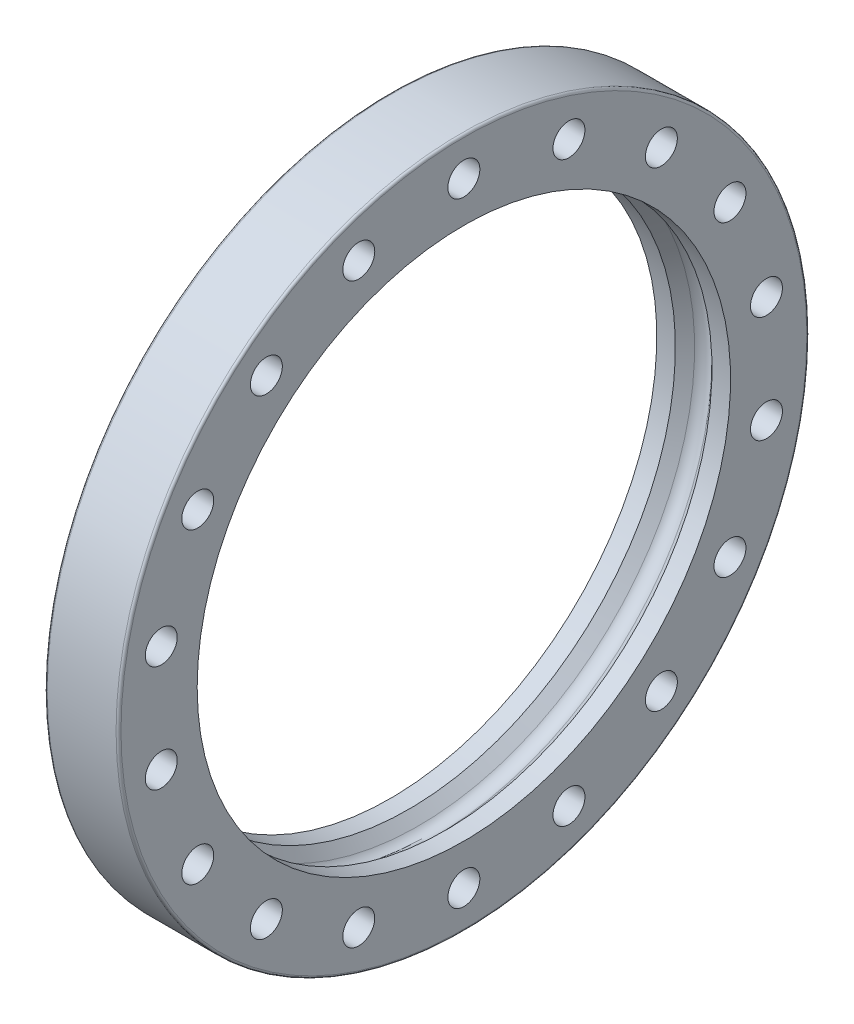
ISO-10303-21;
HEADER;
FILE_DESCRIPTION(('STEP AP214'),'2;1');
FILE_NAME('part.step','',(''),(''),'','','');
FILE_SCHEMA(('AUTOMOTIVE_DESIGN { 1 0 10303 214 1 1 1 1 }'));
ENDSEC;
DATA;
#1=APPLICATION_CONTEXT('core data for automotive mechanical design processes');
#2=APPLICATION_PROTOCOL_DEFINITION('international standard','automotive_design',2000,#1);
#3=PRODUCT_CONTEXT('',#1,'mechanical');
#4=PRODUCT('Part','Part','',(#3));
#5=PRODUCT_RELATED_PRODUCT_CATEGORY('part','',(#4));
#6=PRODUCT_DEFINITION_FORMATION('','',#4);
#7=PRODUCT_DEFINITION_CONTEXT('part definition',#1,'design');
#8=PRODUCT_DEFINITION('design','',#6,#7);
#9=PRODUCT_DEFINITION_SHAPE('','',#8);
#10=(LENGTH_UNIT() NAMED_UNIT(*) SI_UNIT(.MILLI.,.METRE.));
#11=(NAMED_UNIT(*) PLANE_ANGLE_UNIT() SI_UNIT($,.RADIAN.));
#12=(NAMED_UNIT(*) SI_UNIT($,.STERADIAN.) SOLID_ANGLE_UNIT());
#13=UNCERTAINTY_MEASURE_WITH_UNIT(LENGTH_MEASURE(1.E-05),#10,'distance_accuracy_value','');
#14=(GEOMETRIC_REPRESENTATION_CONTEXT(3) GLOBAL_UNCERTAINTY_ASSIGNED_CONTEXT((#13)) GLOBAL_UNIT_ASSIGNED_CONTEXT((#10,
#11,#12)) REPRESENTATION_CONTEXT('',''));
#15=CARTESIAN_POINT('',(0.,0.,0.));
#16=DIRECTION('',(0.,0.,1.));
#17=DIRECTION('',(1.,0.,0.));
#18=AXIS2_PLACEMENT_3D('',#15,#16,#17);
#19=CARTESIAN_POINT('',(0.,0.,0.));
#20=DIRECTION('',(1.,0.,0.));
#21=DIRECTION('',(0.,0.,-1.));
#22=AXIS2_PLACEMENT_3D('',#19,#20,#21);
#23=CONICAL_SURFACE('',#22,115.942388155425,0.785398163397447);
#24=CARTESIAN_POINT('',(-3.53553390593273,0.,0.));
#25=DIRECTION('',(-1.,0.,0.));
#26=DIRECTION('',(0.,0.,1.));
#27=AXIS2_PLACEMENT_3D('',#24,#25,#26);
#28=CIRCLE('',#27,112.406854249492);
#29=CARTESIAN_POINT('',(-3.53553390593273,0.,112.406854249492));
#30=VERTEX_POINT('',#29);
#31=EDGE_CURVE('E10',#30,#30,#28,.F.);
#32=ORIENTED_EDGE('',*,*,#31,.T.);
#33=EDGE_LOOP('',(#32));
#34=FACE_BOUND('',#33,.T.);
#35=CARTESIAN_POINT('',(-7.4423881554251,0.,0.));
#36=DIRECTION('',(-1.,0.,0.));
#37=DIRECTION('',(0.,0.,1.));
#38=AXIS2_PLACEMENT_3D('',#35,#36,#37);
#39=CIRCLE('',#38,108.5);
#40=CARTESIAN_POINT('',(-7.4423881554251,0.,108.5));
#41=VERTEX_POINT('',#40);
#42=EDGE_CURVE('E68',#41,#41,#39,.T.);
#43=ORIENTED_EDGE('',*,*,#42,.T.);
#44=EDGE_LOOP('',(#43));
#45=FACE_BOUND('',#44,.T.);
#46=ADVANCED_FACE('F33',(#34,#45),#23,.F.);
#47=CARTESIAN_POINT('',(0.,0.,0.));
#48=DIRECTION('',(-1.,0.,0.));
#49=DIRECTION('',(0.,0.,1.));
#50=AXIS2_PLACEMENT_3D('',#47,#48,#49);
#51=CONICAL_SURFACE('',#50,115.942388155425,0.785398163397448);
#52=CARTESIAN_POINT('',(3.53553390593277,0.,0.));
#53=DIRECTION('',(1.,0.,0.));
#54=DIRECTION('',(0.,0.,-1.));
#55=AXIS2_PLACEMENT_3D('',#52,#53,#54);
#56=CIRCLE('',#55,112.406854249492);
#57=CARTESIAN_POINT('',(3.53553390593277,0.,-112.406854249492));
#58=VERTEX_POINT('',#57);
#59=EDGE_CURVE('E40',#58,#58,#56,.F.);
#60=ORIENTED_EDGE('',*,*,#59,.T.);
#61=EDGE_LOOP('',(#60));
#62=FACE_BOUND('',#61,.T.);
#63=CARTESIAN_POINT('',(7.44238815542518,0.,0.));
#64=DIRECTION('',(-1.,0.,0.));
#65=DIRECTION('',(0.,0.,1.));
#66=AXIS2_PLACEMENT_3D('',#63,#64,#65);
#67=CIRCLE('',#66,108.5);
#68=CARTESIAN_POINT('',(7.44238815542518,0.,108.5));
#69=VERTEX_POINT('',#68);
#70=EDGE_CURVE('E59',#69,#69,#67,.T.);
#71=ORIENTED_EDGE('',*,*,#70,.F.);
#72=EDGE_LOOP('',(#71));
#73=FACE_BOUND('',#72,.T.);
#74=ADVANCED_FACE('F207',(#62,#73),#51,.F.);
#75=CARTESIAN_POINT('',(0.,0.,0.));
#76=DIRECTION('',(-1.,0.,0.));
#77=DIRECTION('',(0.,0.,1.));
#78=AXIS2_PLACEMENT_3D('',#75,#76,#77);
#79=CYLINDRICAL_SURFACE('',#78,108.5);
#80=ORIENTED_EDGE('',*,*,#70,.T.);
#81=EDGE_LOOP('',(#80));
#82=FACE_BOUND('',#81,.T.);
#83=CARTESIAN_POINT('',(15.,0.,0.));
#84=DIRECTION('',(-1.,0.,0.));
#85=DIRECTION('',(0.,0.,1.));
#86=AXIS2_PLACEMENT_3D('',#83,#84,#85);
#87=CIRCLE('',#86,108.5);
#88=CARTESIAN_POINT('',(15.,0.,108.5));
#89=VERTEX_POINT('',#88);
#90=EDGE_CURVE('E62',#89,#89,#87,.T.);
#91=ORIENTED_EDGE('',*,*,#90,.F.);
#92=EDGE_LOOP('',(#91));
#93=FACE_BOUND('',#92,.T.);
#94=ADVANCED_FACE('F195',(#82,#93),#79,.F.);
#95=CARTESIAN_POINT('',(15.,0.,0.));
#96=DIRECTION('',(1.,0.,0.));
#97=DIRECTION('',(0.,0.,-1.));
#98=AXIS2_PLACEMENT_3D('',#95,#96,#97);
#99=PLANE('',#98);
#100=CARTESIAN_POINT('',(15.,117.461577598239,42.7525179157071));
#101=DIRECTION('',(1.,0.,0.));
#102=DIRECTION('',(0.,0.342020143325657,-0.939692620785913));
#103=AXIS2_PLACEMENT_3D('',#100,#101,#102);
#104=CIRCLE('',#103,6.5);
#105=CARTESIAN_POINT('',(15.,119.684708529856,36.6445158805987));
#106=VERTEX_POINT('',#105);
#107=EDGE_CURVE('E84',#106,#106,#104,.T.);
#108=ORIENTED_EDGE('',*,*,#107,.F.);
#109=EDGE_LOOP('',(#108));
#110=FACE_BOUND('',#109,.T.);
#111=CARTESIAN_POINT('',(15.,95.7555553898733,80.3484512108163));
#112=DIRECTION('',(1.,0.,0.));
#113=DIRECTION('',(0.,0.64278760968653,-0.766044443118986));
#114=AXIS2_PLACEMENT_3D('',#111,#112,#113);
#115=CIRCLE('',#114,6.5);
#116=CARTESIAN_POINT('',(15.,99.9336748528357,75.3691623305429));
#117=VERTEX_POINT('',#116);
#118=EDGE_CURVE('E90',#117,#117,#115,.T.);
#119=ORIENTED_EDGE('',*,*,#118,.F.);
#120=EDGE_LOOP('',(#119));
#121=FACE_BOUND('',#120,.T.);
#122=CARTESIAN_POINT('',(15.,62.5000000000013,108.253175473054));
#123=DIRECTION('',(1.,0.,0.));
#124=DIRECTION('',(0.,0.866025403784433,-0.50000000000001));
#125=AXIS2_PLACEMENT_3D('',#122,#123,#124);
#126=CIRCLE('',#125,6.5);
#127=CARTESIAN_POINT('',(15.,68.1291651246001,105.003175473054));
#128=VERTEX_POINT('',#127);
#129=EDGE_CURVE('E96',#128,#128,#126,.T.);
#130=ORIENTED_EDGE('',*,*,#129,.F.);
#131=EDGE_LOOP('',(#130));
#132=FACE_BOUND('',#131,.T.);
#133=CARTESIAN_POINT('',(15.,21.7060222083676,123.100969126526));
#134=DIRECTION('',(1.,0.,0.));
#135=DIRECTION('',(0.,0.984807753012206,-0.17364817766694));
#136=AXIS2_PLACEMENT_3D('',#133,#134,#135);
#137=CIRCLE('',#136,6.5);
#138=CARTESIAN_POINT('',(15.,28.1072726029469,121.972255971691));
#139=VERTEX_POINT('',#138);
#140=EDGE_CURVE('E102',#139,#139,#137,.T.);
#141=ORIENTED_EDGE('',*,*,#140,.F.);
#142=EDGE_LOOP('',(#141));
#143=FACE_BOUND('',#142,.T.);
#144=CARTESIAN_POINT('',(15.,-21.7060222083651,123.100969126526));
#145=DIRECTION('',(1.,0.,0.));
#146=DIRECTION('',(0.,0.98480775301221,0.173648177666921));
#147=AXIS2_PLACEMENT_3D('',#144,#145,#146);
#148=CIRCLE('',#147,6.5);
#149=CARTESIAN_POINT('',(15.,-15.3047718137857,124.229682281361));
#150=VERTEX_POINT('',#149);
#151=EDGE_CURVE('E108',#150,#150,#148,.T.);
#152=ORIENTED_EDGE('',*,*,#151,.F.);
#153=EDGE_LOOP('',(#152));
#154=FACE_BOUND('',#153,.T.);
#155=CARTESIAN_POINT('',(15.,-62.499999999999,108.253175473055));
#156=DIRECTION('',(1.,0.,0.));
#157=DIRECTION('',(0.,0.866025403784443,0.499999999999992));
#158=AXIS2_PLACEMENT_3D('',#155,#156,#157);
#159=CIRCLE('',#158,6.5);
#160=CARTESIAN_POINT('',(15.,-56.8708348754001,111.503175473055));
#161=VERTEX_POINT('',#160);
#162=EDGE_CURVE('E114',#161,#161,#159,.T.);
#163=ORIENTED_EDGE('',*,*,#162,.F.);
#164=EDGE_LOOP('',(#163));
#165=FACE_BOUND('',#164,.T.);
#166=CARTESIAN_POINT('',(15.,-95.7555553898716,80.3484512108182));
#167=DIRECTION('',(1.,0.,0.));
#168=DIRECTION('',(0.,0.642787609686546,0.766044443118973));
#169=AXIS2_PLACEMENT_3D('',#166,#167,#168);
#170=CIRCLE('',#169,6.5);
#171=CARTESIAN_POINT('',(15.,-91.577435926909,85.3277400910915));
#172=VERTEX_POINT('',#171);
#173=EDGE_CURVE('E120',#172,#172,#170,.T.);
#174=ORIENTED_EDGE('',*,*,#173,.F.);
#175=EDGE_LOOP('',(#174));
#176=FACE_BOUND('',#175,.T.);
#177=CARTESIAN_POINT('',(15.,-117.461577598238,42.7525179157095));
#178=DIRECTION('',(1.,0.,0.));
#179=DIRECTION('',(0.,0.342020143325676,0.939692620785906));
#180=AXIS2_PLACEMENT_3D('',#177,#178,#179);
#181=CIRCLE('',#180,6.5);
#182=CARTESIAN_POINT('',(15.,-115.238446666621,48.8605199508179));
#183=VERTEX_POINT('',#182);
#184=EDGE_CURVE('E126',#183,#183,#181,.T.);
#185=ORIENTED_EDGE('',*,*,#184,.F.);
#186=EDGE_LOOP('',(#185));
#187=FACE_BOUND('',#186,.T.);
#188=CARTESIAN_POINT('',(15.,-125.,0.));
#189=DIRECTION('',(1.,0.,0.));
#190=DIRECTION('',(0.,0.,1.));
#191=AXIS2_PLACEMENT_3D('',#188,#189,#190);
#192=CIRCLE('',#191,6.5);
#193=CARTESIAN_POINT('',(15.,-125.,6.5));
#194=VERTEX_POINT('',#193);
#195=EDGE_CURVE('E132',#194,#194,#192,.T.);
#196=ORIENTED_EDGE('',*,*,#195,.F.);
#197=EDGE_LOOP('',(#196));
#198=FACE_BOUND('',#197,.T.);
#199=CARTESIAN_POINT('',(15.,-117.461577598239,-42.7525179157079));
#200=DIRECTION('',(1.,0.,0.));
#201=DIRECTION('',(0.,-0.342020143325663,0.939692620785911));
#202=AXIS2_PLACEMENT_3D('',#199,#200,#201);
#203=CIRCLE('',#202,6.5);
#204=CARTESIAN_POINT('',(15.,-119.684708529856,-36.6445158805995));
#205=VERTEX_POINT('',#204);
#206=EDGE_CURVE('E138',#205,#205,#203,.T.);
#207=ORIENTED_EDGE('',*,*,#206,.F.);
#208=EDGE_LOOP('',(#207));
#209=FACE_BOUND('',#208,.T.);
#210=CARTESIAN_POINT('',(15.,-95.7555553898727,-80.3484512108169));
#211=DIRECTION('',(1.,0.,0.));
#212=DIRECTION('',(0.,-0.642787609686535,0.766044443118981));
#213=AXIS2_PLACEMENT_3D('',#210,#211,#212);
#214=CIRCLE('',#213,6.5);
#215=CARTESIAN_POINT('',(15.,-99.9336748528352,-75.3691623305435));
#216=VERTEX_POINT('',#215);
#217=EDGE_CURVE('E144',#216,#216,#214,.T.);
#218=ORIENTED_EDGE('',*,*,#217,.F.);
#219=EDGE_LOOP('',(#218));
#220=FACE_BOUND('',#219,.T.);
#221=CARTESIAN_POINT('',(15.,-62.5000000000005,-108.253175473055));
#222=DIRECTION('',(1.,0.,0.));
#223=DIRECTION('',(0.,-0.866025403784436,0.500000000000004));
#224=AXIS2_PLACEMENT_3D('',#221,#222,#223);
#225=CIRCLE('',#224,6.5);
#226=CARTESIAN_POINT('',(15.,-68.1291651245994,-105.003175473055));
#227=VERTEX_POINT('',#226);
#228=EDGE_CURVE('E150',#227,#227,#225,.T.);
#229=ORIENTED_EDGE('',*,*,#228,.F.);
#230=EDGE_LOOP('',(#229));
#231=FACE_BOUND('',#230,.T.);
#232=CARTESIAN_POINT('',(15.,-21.7060222083668,-123.100969126526));
#233=DIRECTION('',(1.,0.,0.));
#234=DIRECTION('',(0.,-0.984807753012207,0.173648177666934));
#235=AXIS2_PLACEMENT_3D('',#232,#233,#234);
#236=CIRCLE('',#235,6.5);
#237=CARTESIAN_POINT('',(15.,-28.1072726029461,-121.972255971691));
#238=VERTEX_POINT('',#237);
#239=EDGE_CURVE('E156',#238,#238,#236,.T.);
#240=ORIENTED_EDGE('',*,*,#239,.F.);
#241=EDGE_LOOP('',(#240));
#242=FACE_BOUND('',#241,.T.);
#243=CARTESIAN_POINT('',(15.,21.7060222083659,-123.100969126526));
#244=DIRECTION('',(1.,0.,0.));
#245=DIRECTION('',(0.,-0.984807753012209,-0.173648177666927));
#246=AXIS2_PLACEMENT_3D('',#243,#244,#245);
#247=CIRCLE('',#246,6.5);
#248=CARTESIAN_POINT('',(15.,15.3047718137866,-124.229682281361));
#249=VERTEX_POINT('',#248);
#250=EDGE_CURVE('E162',#249,#249,#247,.T.);
#251=ORIENTED_EDGE('',*,*,#250,.F.);
#252=EDGE_LOOP('',(#251));
#253=FACE_BOUND('',#252,.T.);
#254=CARTESIAN_POINT('',(15.,62.4999999999998,-108.253175473055));
#255=DIRECTION('',(1.,0.,0.));
#256=DIRECTION('',(0.,-0.86602540378444,-0.499999999999998));
#257=AXIS2_PLACEMENT_3D('',#254,#255,#256);
#258=CIRCLE('',#257,6.5);
#259=CARTESIAN_POINT('',(15.,56.8708348754009,-111.503175473055));
#260=VERTEX_POINT('',#259);
#261=EDGE_CURVE('E168',#260,#260,#258,.T.);
#262=ORIENTED_EDGE('',*,*,#261,.F.);
#263=EDGE_LOOP('',(#262));
#264=FACE_BOUND('',#263,.T.);
#265=CARTESIAN_POINT('',(15.,95.7555553898722,-80.3484512108176));
#266=DIRECTION('',(1.,0.,0.));
#267=DIRECTION('',(0.,-0.642787609686541,-0.766044443118977));
#268=AXIS2_PLACEMENT_3D('',#265,#266,#267);
#269=CIRCLE('',#268,6.5);
#270=CARTESIAN_POINT('',(15.,91.5774359269096,-85.3277400910909));
#271=VERTEX_POINT('',#270);
#272=EDGE_CURVE('E174',#271,#271,#269,.T.);
#273=ORIENTED_EDGE('',*,*,#272,.F.);
#274=EDGE_LOOP('',(#273));
#275=FACE_BOUND('',#274,.T.);
#276=CARTESIAN_POINT('',(15.,117.461577598239,-42.7525179157087));
#277=DIRECTION('',(1.,0.,0.));
#278=DIRECTION('',(0.,-0.342020143325669,-0.939692620785908));
#279=AXIS2_PLACEMENT_3D('',#276,#277,#278);
#280=CIRCLE('',#279,6.5);
#281=CARTESIAN_POINT('',(15.,115.238446666622,-48.8605199508171));
#282=VERTEX_POINT('',#281);
#283=EDGE_CURVE('E78',#282,#282,#280,.T.);
#284=ORIENTED_EDGE('',*,*,#283,.F.);
#285=EDGE_LOOP('',(#284));
#286=FACE_BOUND('',#285,.T.);
#287=CARTESIAN_POINT('',(15.,125.,0.));
#288=DIRECTION('',(1.,0.,0.));
#289=DIRECTION('',(0.,0.,-1.));
#290=AXIS2_PLACEMENT_3D('',#287,#288,#289);
#291=CIRCLE('',#290,6.5);
#292=CARTESIAN_POINT('',(15.,125.,-6.5));
#293=VERTEX_POINT('',#292);
#294=EDGE_CURVE('E72',#293,#293,#291,.T.);
#295=ORIENTED_EDGE('',*,*,#294,.F.);
#296=EDGE_LOOP('',(#295));
#297=FACE_BOUND('',#296,.T.);
#298=CARTESIAN_POINT('',(15.,0.,0.));
#299=DIRECTION('',(1.,0.,0.));
#300=DIRECTION('',(0.,0.,-1.));
#301=AXIS2_PLACEMENT_3D('',#298,#299,#300);
#302=CIRCLE('',#301,139.5);
#303=CARTESIAN_POINT('',(15.,0.,-139.5));
#304=VERTEX_POINT('',#303);
#305=EDGE_CURVE('E48',#304,#304,#302,.T.);
#306=ORIENTED_EDGE('',*,*,#305,.T.);
#307=EDGE_LOOP('',(#306));
#308=FACE_BOUND('',#307,.T.);
#309=ORIENTED_EDGE('',*,*,#90,.T.);
#310=EDGE_LOOP('',(#309));
#311=FACE_BOUND('',#310,.T.);
#312=ADVANCED_FACE('F191',(#110,#121,#132,#143,#154,#165,#176,#187,#198,#209,#220,#231,#242,
#253,#264,#275,#286,#297,#308,#311),#99,.T.);
#313=CARTESIAN_POINT('',(0.,0.,0.));
#314=DIRECTION('',(-1.,0.,0.));
#315=DIRECTION('',(0.,0.,1.));
#316=AXIS2_PLACEMENT_3D('',#313,#314,#315);
#317=CYLINDRICAL_SURFACE('',#316,140.5);
#318=CARTESIAN_POINT('',(14.,0.,0.));
#319=DIRECTION('',(1.,0.,0.));
#320=DIRECTION('',(0.,0.,-1.));
#321=AXIS2_PLACEMENT_3D('',#318,#319,#320);
#322=CIRCLE('',#321,140.5);
#323=CARTESIAN_POINT('',(14.,0.,-140.5));
#324=VERTEX_POINT('',#323);
#325=EDGE_CURVE('E53',#324,#324,#322,.F.);
#326=ORIENTED_EDGE('',*,*,#325,.T.);
#327=EDGE_LOOP('',(#326));
#328=FACE_BOUND('',#327,.T.);
#329=CARTESIAN_POINT('',(-14.,0.,0.));
#330=DIRECTION('',(1.,0.,0.));
#331=DIRECTION('',(0.,0.,-1.));
#332=AXIS2_PLACEMENT_3D('',#329,#330,#331);
#333=CIRCLE('',#332,140.5);
#334=CARTESIAN_POINT('',(-14.,0.,-140.5));
#335=VERTEX_POINT('',#334);
#336=EDGE_CURVE('E56',#335,#335,#333,.T.);
#337=ORIENTED_EDGE('',*,*,#336,.T.);
#338=EDGE_LOOP('',(#337));
#339=FACE_BOUND('',#338,.T.);
#340=ADVANCED_FACE('F194',(#328,#339),#317,.T.);
#341=CARTESIAN_POINT('',(-15.,0.,0.));
#342=DIRECTION('',(1.,0.,0.));
#343=DIRECTION('',(0.,0.,-1.));
#344=AXIS2_PLACEMENT_3D('',#341,#342,#343);
#345=PLANE('',#344);
#346=CARTESIAN_POINT('',(-15.,117.461577598239,42.7525179157071));
#347=DIRECTION('',(1.,0.,0.));
#348=DIRECTION('',(0.,0.342020143325657,-0.939692620785913));
#349=AXIS2_PLACEMENT_3D('',#346,#347,#348);
#350=CIRCLE('',#349,6.5);
#351=CARTESIAN_POINT('',(-15.,119.684708529856,36.6445158805987));
#352=VERTEX_POINT('',#351);
#353=EDGE_CURVE('E87',#352,#352,#350,.T.);
#354=ORIENTED_EDGE('',*,*,#353,.T.);
#355=EDGE_LOOP('',(#354));
#356=FACE_BOUND('',#355,.T.);
#357=CARTESIAN_POINT('',(-15.,95.7555553898733,80.3484512108163));
#358=DIRECTION('',(1.,0.,0.));
#359=DIRECTION('',(0.,0.64278760968653,-0.766044443118986));
#360=AXIS2_PLACEMENT_3D('',#357,#358,#359);
#361=CIRCLE('',#360,6.5);
#362=CARTESIAN_POINT('',(-15.,99.9336748528357,75.3691623305429));
#363=VERTEX_POINT('',#362);
#364=EDGE_CURVE('E93',#363,#363,#361,.T.);
#365=ORIENTED_EDGE('',*,*,#364,.T.);
#366=EDGE_LOOP('',(#365));
#367=FACE_BOUND('',#366,.T.);
#368=CARTESIAN_POINT('',(-15.,62.5000000000013,108.253175473054));
#369=DIRECTION('',(1.,0.,0.));
#370=DIRECTION('',(0.,0.866025403784433,-0.50000000000001));
#371=AXIS2_PLACEMENT_3D('',#368,#369,#370);
#372=CIRCLE('',#371,6.5);
#373=CARTESIAN_POINT('',(-15.,68.1291651246001,105.003175473054));
#374=VERTEX_POINT('',#373);
#375=EDGE_CURVE('E99',#374,#374,#372,.T.);
#376=ORIENTED_EDGE('',*,*,#375,.T.);
#377=EDGE_LOOP('',(#376));
#378=FACE_BOUND('',#377,.T.);
#379=CARTESIAN_POINT('',(-15.,21.7060222083676,123.100969126526));
#380=DIRECTION('',(1.,0.,0.));
#381=DIRECTION('',(0.,0.984807753012206,-0.17364817766694));
#382=AXIS2_PLACEMENT_3D('',#379,#380,#381);
#383=CIRCLE('',#382,6.5);
#384=CARTESIAN_POINT('',(-15.,28.1072726029469,121.972255971691));
#385=VERTEX_POINT('',#384);
#386=EDGE_CURVE('E105',#385,#385,#383,.T.);
#387=ORIENTED_EDGE('',*,*,#386,.T.);
#388=EDGE_LOOP('',(#387));
#389=FACE_BOUND('',#388,.T.);
#390=CARTESIAN_POINT('',(-15.,-21.7060222083651,123.100969126526));
#391=DIRECTION('',(1.,0.,0.));
#392=DIRECTION('',(0.,0.98480775301221,0.173648177666921));
#393=AXIS2_PLACEMENT_3D('',#390,#391,#392);
#394=CIRCLE('',#393,6.5);
#395=CARTESIAN_POINT('',(-15.,-15.3047718137857,124.229682281361));
#396=VERTEX_POINT('',#395);
#397=EDGE_CURVE('E111',#396,#396,#394,.T.);
#398=ORIENTED_EDGE('',*,*,#397,.T.);
#399=EDGE_LOOP('',(#398));
#400=FACE_BOUND('',#399,.T.);
#401=CARTESIAN_POINT('',(-15.,-62.499999999999,108.253175473055));
#402=DIRECTION('',(1.,0.,0.));
#403=DIRECTION('',(0.,0.866025403784443,0.499999999999992));
#404=AXIS2_PLACEMENT_3D('',#401,#402,#403);
#405=CIRCLE('',#404,6.5);
#406=CARTESIAN_POINT('',(-15.,-56.8708348754001,111.503175473055));
#407=VERTEX_POINT('',#406);
#408=EDGE_CURVE('E117',#407,#407,#405,.T.);
#409=ORIENTED_EDGE('',*,*,#408,.T.);
#410=EDGE_LOOP('',(#409));
#411=FACE_BOUND('',#410,.T.);
#412=CARTESIAN_POINT('',(-15.,-95.7555553898716,80.3484512108182));
#413=DIRECTION('',(1.,0.,0.));
#414=DIRECTION('',(0.,0.642787609686546,0.766044443118973));
#415=AXIS2_PLACEMENT_3D('',#412,#413,#414);
#416=CIRCLE('',#415,6.5);
#417=CARTESIAN_POINT('',(-15.,-91.577435926909,85.3277400910915));
#418=VERTEX_POINT('',#417);
#419=EDGE_CURVE('E123',#418,#418,#416,.T.);
#420=ORIENTED_EDGE('',*,*,#419,.T.);
#421=EDGE_LOOP('',(#420));
#422=FACE_BOUND('',#421,.T.);
#423=CARTESIAN_POINT('',(-15.,-117.461577598238,42.7525179157095));
#424=DIRECTION('',(1.,0.,0.));
#425=DIRECTION('',(0.,0.342020143325676,0.939692620785906));
#426=AXIS2_PLACEMENT_3D('',#423,#424,#425);
#427=CIRCLE('',#426,6.5);
#428=CARTESIAN_POINT('',(-15.,-115.238446666621,48.8605199508179));
#429=VERTEX_POINT('',#428);
#430=EDGE_CURVE('E129',#429,#429,#427,.T.);
#431=ORIENTED_EDGE('',*,*,#430,.T.);
#432=EDGE_LOOP('',(#431));
#433=FACE_BOUND('',#432,.T.);
#434=CARTESIAN_POINT('',(-15.,-125.,0.));
#435=DIRECTION('',(1.,0.,0.));
#436=DIRECTION('',(0.,0.,1.));
#437=AXIS2_PLACEMENT_3D('',#434,#435,#436);
#438=CIRCLE('',#437,6.5);
#439=CARTESIAN_POINT('',(-15.,-125.,6.5));
#440=VERTEX_POINT('',#439);
#441=EDGE_CURVE('E135',#440,#440,#438,.T.);
#442=ORIENTED_EDGE('',*,*,#441,.T.);
#443=EDGE_LOOP('',(#442));
#444=FACE_BOUND('',#443,.T.);
#445=CARTESIAN_POINT('',(-15.,-117.461577598239,-42.7525179157079));
#446=DIRECTION('',(1.,0.,0.));
#447=DIRECTION('',(0.,-0.342020143325663,0.939692620785911));
#448=AXIS2_PLACEMENT_3D('',#445,#446,#447);
#449=CIRCLE('',#448,6.5);
#450=CARTESIAN_POINT('',(-15.,-119.684708529856,-36.6445158805995));
#451=VERTEX_POINT('',#450);
#452=EDGE_CURVE('E141',#451,#451,#449,.T.);
#453=ORIENTED_EDGE('',*,*,#452,.T.);
#454=EDGE_LOOP('',(#453));
#455=FACE_BOUND('',#454,.T.);
#456=CARTESIAN_POINT('',(-15.,-95.7555553898727,-80.3484512108169));
#457=DIRECTION('',(1.,0.,0.));
#458=DIRECTION('',(0.,-0.642787609686535,0.766044443118981));
#459=AXIS2_PLACEMENT_3D('',#456,#457,#458);
#460=CIRCLE('',#459,6.5);
#461=CARTESIAN_POINT('',(-15.,-99.9336748528352,-75.3691623305435));
#462=VERTEX_POINT('',#461);
#463=EDGE_CURVE('E147',#462,#462,#460,.T.);
#464=ORIENTED_EDGE('',*,*,#463,.T.);
#465=EDGE_LOOP('',(#464));
#466=FACE_BOUND('',#465,.T.);
#467=CARTESIAN_POINT('',(-15.,-62.5000000000005,-108.253175473055));
#468=DIRECTION('',(1.,0.,0.));
#469=DIRECTION('',(0.,-0.866025403784436,0.500000000000004));
#470=AXIS2_PLACEMENT_3D('',#467,#468,#469);
#471=CIRCLE('',#470,6.5);
#472=CARTESIAN_POINT('',(-15.,-68.1291651245994,-105.003175473055));
#473=VERTEX_POINT('',#472);
#474=EDGE_CURVE('E153',#473,#473,#471,.T.);
#475=ORIENTED_EDGE('',*,*,#474,.T.);
#476=EDGE_LOOP('',(#475));
#477=FACE_BOUND('',#476,.T.);
#478=CARTESIAN_POINT('',(-15.,-21.7060222083668,-123.100969126526));
#479=DIRECTION('',(1.,0.,0.));
#480=DIRECTION('',(0.,-0.984807753012207,0.173648177666934));
#481=AXIS2_PLACEMENT_3D('',#478,#479,#480);
#482=CIRCLE('',#481,6.5);
#483=CARTESIAN_POINT('',(-15.,-28.1072726029461,-121.972255971691));
#484=VERTEX_POINT('',#483);
#485=EDGE_CURVE('E159',#484,#484,#482,.T.);
#486=ORIENTED_EDGE('',*,*,#485,.T.);
#487=EDGE_LOOP('',(#486));
#488=FACE_BOUND('',#487,.T.);
#489=CARTESIAN_POINT('',(-15.,21.7060222083659,-123.100969126526));
#490=DIRECTION('',(1.,0.,0.));
#491=DIRECTION('',(0.,-0.984807753012209,-0.173648177666927));
#492=AXIS2_PLACEMENT_3D('',#489,#490,#491);
#493=CIRCLE('',#492,6.5);
#494=CARTESIAN_POINT('',(-15.,15.3047718137866,-124.229682281361));
#495=VERTEX_POINT('',#494);
#496=EDGE_CURVE('E165',#495,#495,#493,.T.);
#497=ORIENTED_EDGE('',*,*,#496,.T.);
#498=EDGE_LOOP('',(#497));
#499=FACE_BOUND('',#498,.T.);
#500=CARTESIAN_POINT('',(-15.,62.4999999999998,-108.253175473055));
#501=DIRECTION('',(1.,0.,0.));
#502=DIRECTION('',(0.,-0.86602540378444,-0.499999999999998));
#503=AXIS2_PLACEMENT_3D('',#500,#501,#502);
#504=CIRCLE('',#503,6.5);
#505=CARTESIAN_POINT('',(-15.,56.8708348754009,-111.503175473055));
#506=VERTEX_POINT('',#505);
#507=EDGE_CURVE('E171',#506,#506,#504,.T.);
#508=ORIENTED_EDGE('',*,*,#507,.T.);
#509=EDGE_LOOP('',(#508));
#510=FACE_BOUND('',#509,.T.);
#511=CARTESIAN_POINT('',(-15.,95.7555553898722,-80.3484512108176));
#512=DIRECTION('',(1.,0.,0.));
#513=DIRECTION('',(0.,-0.642787609686541,-0.766044443118977));
#514=AXIS2_PLACEMENT_3D('',#511,#512,#513);
#515=CIRCLE('',#514,6.5);
#516=CARTESIAN_POINT('',(-15.,91.5774359269096,-85.3277400910909));
#517=VERTEX_POINT('',#516);
#518=EDGE_CURVE('E81',#517,#517,#515,.T.);
#519=ORIENTED_EDGE('',*,*,#518,.T.);
#520=EDGE_LOOP('',(#519));
#521=FACE_BOUND('',#520,.T.);
#522=CARTESIAN_POINT('',(-15.,117.461577598239,-42.7525179157087));
#523=DIRECTION('',(1.,0.,0.));
#524=DIRECTION('',(0.,-0.342020143325669,-0.939692620785908));
#525=AXIS2_PLACEMENT_3D('',#522,#523,#524);
#526=CIRCLE('',#525,6.5);
#527=CARTESIAN_POINT('',(-15.,115.238446666622,-48.8605199508171));
#528=VERTEX_POINT('',#527);
#529=EDGE_CURVE('E75',#528,#528,#526,.T.);
#530=ORIENTED_EDGE('',*,*,#529,.T.);
#531=EDGE_LOOP('',(#530));
#532=FACE_BOUND('',#531,.T.);
#533=CARTESIAN_POINT('',(-15.,125.,0.));
#534=DIRECTION('',(1.,0.,0.));
#535=DIRECTION('',(0.,0.,-1.));
#536=AXIS2_PLACEMENT_3D('',#533,#534,#535);
#537=CIRCLE('',#536,6.5);
#538=CARTESIAN_POINT('',(-15.,125.,-6.5));
#539=VERTEX_POINT('',#538);
#540=EDGE_CURVE('E71',#539,#539,#537,.T.);
#541=ORIENTED_EDGE('',*,*,#540,.T.);
#542=EDGE_LOOP('',(#541));
#543=FACE_BOUND('',#542,.T.);
#544=CARTESIAN_POINT('',(-15.,0.,0.));
#545=DIRECTION('',(1.,0.,0.));
#546=DIRECTION('',(0.,0.,-1.));
#547=AXIS2_PLACEMENT_3D('',#544,#545,#546);
#548=CIRCLE('',#547,139.5);
#549=CARTESIAN_POINT('',(-15.,0.,-139.5));
#550=VERTEX_POINT('',#549);
#551=EDGE_CURVE('E44',#550,#550,#548,.F.);
#552=ORIENTED_EDGE('',*,*,#551,.T.);
#553=EDGE_LOOP('',(#552));
#554=FACE_BOUND('',#553,.T.);
#555=CARTESIAN_POINT('',(-15.,0.,0.));
#556=DIRECTION('',(-1.,0.,0.));
#557=DIRECTION('',(0.,0.,1.));
#558=AXIS2_PLACEMENT_3D('',#555,#556,#557);
#559=CIRCLE('',#558,108.5);
#560=CARTESIAN_POINT('',(-15.,0.,108.5));
#561=VERTEX_POINT('',#560);
#562=EDGE_CURVE('E65',#561,#561,#559,.T.);
#563=ORIENTED_EDGE('',*,*,#562,.F.);
#564=EDGE_LOOP('',(#563));
#565=FACE_BOUND('',#564,.T.);
#566=ADVANCED_FACE('F180',(#356,#367,#378,#389,#400,#411,#422,#433,#444,#455,#466,#477,#488,
#499,#510,#521,#532,#543,#554,#565),#345,.F.);
#567=ORIENTED_EDGE('',*,*,#562,.T.);
#568=EDGE_LOOP('',(#567));
#569=FACE_BOUND('',#568,.T.);
#570=ORIENTED_EDGE('',*,*,#42,.F.);
#571=EDGE_LOOP('',(#570));
#572=FACE_BOUND('',#571,.T.);
#573=ADVANCED_FACE('F210',(#569,#572),#79,.F.);
#574=CARTESIAN_POINT('',(14.,0.,0.));
#575=DIRECTION('',(1.,0.,0.));
#576=DIRECTION('',(0.,0.,-1.));
#577=AXIS2_PLACEMENT_3D('',#574,#575,#576);
#578=TOROIDAL_SURFACE('',#577,139.5,1.);
#579=ORIENTED_EDGE('',*,*,#305,.F.);
#580=EDGE_LOOP('',(#579));
#581=FACE_BOUND('',#580,.T.);
#582=ORIENTED_EDGE('',*,*,#325,.F.);
#583=EDGE_LOOP('',(#582));
#584=FACE_BOUND('',#583,.T.);
#585=ADVANCED_FACE('F218',(#581,#584),#578,.T.);
#586=CARTESIAN_POINT('',(-14.,0.,0.));
#587=DIRECTION('',(1.,0.,0.));
#588=DIRECTION('',(0.,0.,-1.));
#589=AXIS2_PLACEMENT_3D('',#586,#587,#588);
#590=TOROIDAL_SURFACE('',#589,139.5,1.);
#591=ORIENTED_EDGE('',*,*,#336,.F.);
#592=EDGE_LOOP('',(#591));
#593=FACE_BOUND('',#592,.T.);
#594=ORIENTED_EDGE('',*,*,#551,.F.);
#595=EDGE_LOOP('',(#594));
#596=FACE_BOUND('',#595,.T.);
#597=ADVANCED_FACE('F227',(#593,#596),#590,.T.);
#598=CARTESIAN_POINT('',(0.,0.,0.));
#599=DIRECTION('',(-1.,0.,0.));
#600=DIRECTION('',(0.,0.,1.));
#601=AXIS2_PLACEMENT_3D('',#598,#599,#600);
#602=TOROIDAL_SURFACE('',#601,108.87132034356,5.);
#603=ORIENTED_EDGE('',*,*,#31,.F.);
#604=EDGE_LOOP('',(#603));
#605=FACE_BOUND('',#604,.T.);
#606=ORIENTED_EDGE('',*,*,#59,.F.);
#607=EDGE_LOOP('',(#606));
#608=FACE_BOUND('',#607,.T.);
#609=ADVANCED_FACE('F35',(#605,#608),#602,.F.);
#610=CARTESIAN_POINT('',(-15.,125.,0.));
#611=DIRECTION('',(1.,0.,0.));
#612=DIRECTION('',(0.,0.,-1.));
#613=AXIS2_PLACEMENT_3D('',#610,#611,#612);
#614=CYLINDRICAL_SURFACE('',#613,6.5);
#615=ORIENTED_EDGE('',*,*,#540,.F.);
#616=EDGE_LOOP('',(#615));
#617=FACE_BOUND('',#616,.T.);
#618=ORIENTED_EDGE('',*,*,#294,.T.);
#619=EDGE_LOOP('',(#618));
#620=FACE_BOUND('',#619,.T.);
#621=ADVANCED_FACE('F234',(#617,#620),#614,.F.);
#622=CARTESIAN_POINT('',(-15.,117.461577598239,-42.7525179157087));
#623=DIRECTION('',(1.,0.,0.));
#624=DIRECTION('',(0.,0.,-1.));
#625=AXIS2_PLACEMENT_3D('',#622,#623,#624);
#626=CYLINDRICAL_SURFACE('',#625,6.5);
#627=ORIENTED_EDGE('',*,*,#529,.F.);
#628=EDGE_LOOP('',(#627));
#629=FACE_BOUND('',#628,.T.);
#630=ORIENTED_EDGE('',*,*,#283,.T.);
#631=EDGE_LOOP('',(#630));
#632=FACE_BOUND('',#631,.T.);
#633=ADVANCED_FACE('F187',(#629,#632),#626,.F.);
#634=CARTESIAN_POINT('',(-15.,95.7555553898722,-80.3484512108176));
#635=DIRECTION('',(1.,0.,0.));
#636=DIRECTION('',(0.,0.,-1.));
#637=AXIS2_PLACEMENT_3D('',#634,#635,#636);
#638=CYLINDRICAL_SURFACE('',#637,6.5);
#639=ORIENTED_EDGE('',*,*,#518,.F.);
#640=EDGE_LOOP('',(#639));
#641=FACE_BOUND('',#640,.T.);
#642=ORIENTED_EDGE('',*,*,#272,.T.);
#643=EDGE_LOOP('',(#642));
#644=FACE_BOUND('',#643,.T.);
#645=ADVANCED_FACE('F183',(#641,#644),#638,.F.);
#646=CARTESIAN_POINT('',(-15.,62.4999999999998,-108.253175473055));
#647=DIRECTION('',(1.,0.,0.));
#648=DIRECTION('',(0.,0.,-1.));
#649=AXIS2_PLACEMENT_3D('',#646,#647,#648);
#650=CYLINDRICAL_SURFACE('',#649,6.5);
#651=ORIENTED_EDGE('',*,*,#507,.F.);
#652=EDGE_LOOP('',(#651));
#653=FACE_BOUND('',#652,.T.);
#654=ORIENTED_EDGE('',*,*,#261,.T.);
#655=EDGE_LOOP('',(#654));
#656=FACE_BOUND('',#655,.T.);
#657=ADVANCED_FACE('F186',(#653,#656),#650,.F.);
#658=CARTESIAN_POINT('',(-15.,21.7060222083659,-123.100969126526));
#659=DIRECTION('',(1.,0.,0.));
#660=DIRECTION('',(0.,0.,-1.));
#661=AXIS2_PLACEMENT_3D('',#658,#659,#660);
#662=CYLINDRICAL_SURFACE('',#661,6.5);
#663=ORIENTED_EDGE('',*,*,#496,.F.);
#664=EDGE_LOOP('',(#663));
#665=FACE_BOUND('',#664,.T.);
#666=ORIENTED_EDGE('',*,*,#250,.T.);
#667=EDGE_LOOP('',(#666));
#668=FACE_BOUND('',#667,.T.);
#669=ADVANCED_FACE('F283',(#665,#668),#662,.F.);
#670=CARTESIAN_POINT('',(-15.,-21.7060222083668,-123.100969126526));
#671=DIRECTION('',(1.,0.,0.));
#672=DIRECTION('',(0.,0.,-1.));
#673=AXIS2_PLACEMENT_3D('',#670,#671,#672);
#674=CYLINDRICAL_SURFACE('',#673,6.5);
#675=ORIENTED_EDGE('',*,*,#485,.F.);
#676=EDGE_LOOP('',(#675));
#677=FACE_BOUND('',#676,.T.);
#678=ORIENTED_EDGE('',*,*,#239,.T.);
#679=EDGE_LOOP('',(#678));
#680=FACE_BOUND('',#679,.T.);
#681=ADVANCED_FACE('F290',(#677,#680),#674,.F.);
#682=CARTESIAN_POINT('',(-15.,-62.5000000000005,-108.253175473055));
#683=DIRECTION('',(1.,0.,0.));
#684=DIRECTION('',(0.,0.,-1.));
#685=AXIS2_PLACEMENT_3D('',#682,#683,#684);
#686=CYLINDRICAL_SURFACE('',#685,6.5);
#687=ORIENTED_EDGE('',*,*,#474,.F.);
#688=EDGE_LOOP('',(#687));
#689=FACE_BOUND('',#688,.T.);
#690=ORIENTED_EDGE('',*,*,#228,.T.);
#691=EDGE_LOOP('',(#690));
#692=FACE_BOUND('',#691,.T.);
#693=ADVANCED_FACE('F296',(#689,#692),#686,.F.);
#694=CARTESIAN_POINT('',(-15.,-95.7555553898727,-80.3484512108169));
#695=DIRECTION('',(1.,0.,0.));
#696=DIRECTION('',(0.,0.,-1.));
#697=AXIS2_PLACEMENT_3D('',#694,#695,#696);
#698=CYLINDRICAL_SURFACE('',#697,6.5);
#699=ORIENTED_EDGE('',*,*,#463,.F.);
#700=EDGE_LOOP('',(#699));
#701=FACE_BOUND('',#700,.T.);
#702=ORIENTED_EDGE('',*,*,#217,.T.);
#703=EDGE_LOOP('',(#702));
#704=FACE_BOUND('',#703,.T.);
#705=ADVANCED_FACE('F300',(#701,#704),#698,.F.);
#706=CARTESIAN_POINT('',(-15.,-117.461577598239,-42.7525179157079));
#707=DIRECTION('',(1.,0.,0.));
#708=DIRECTION('',(0.,0.,-1.));
#709=AXIS2_PLACEMENT_3D('',#706,#707,#708);
#710=CYLINDRICAL_SURFACE('',#709,6.5);
#711=ORIENTED_EDGE('',*,*,#452,.F.);
#712=EDGE_LOOP('',(#711));
#713=FACE_BOUND('',#712,.T.);
#714=ORIENTED_EDGE('',*,*,#206,.T.);
#715=EDGE_LOOP('',(#714));
#716=FACE_BOUND('',#715,.T.);
#717=ADVANCED_FACE('F304',(#713,#716),#710,.F.);
#718=CARTESIAN_POINT('',(-15.,-125.,0.));
#719=DIRECTION('',(1.,0.,0.));
#720=DIRECTION('',(0.,0.,-1.));
#721=AXIS2_PLACEMENT_3D('',#718,#719,#720);
#722=CYLINDRICAL_SURFACE('',#721,6.5);
#723=ORIENTED_EDGE('',*,*,#441,.F.);
#724=EDGE_LOOP('',(#723));
#725=FACE_BOUND('',#724,.T.);
#726=ORIENTED_EDGE('',*,*,#195,.T.);
#727=EDGE_LOOP('',(#726));
#728=FACE_BOUND('',#727,.T.);
#729=ADVANCED_FACE('F308',(#725,#728),#722,.F.);
#730=CARTESIAN_POINT('',(-15.,-117.461577598238,42.7525179157095));
#731=DIRECTION('',(1.,0.,0.));
#732=DIRECTION('',(0.,0.,-1.));
#733=AXIS2_PLACEMENT_3D('',#730,#731,#732);
#734=CYLINDRICAL_SURFACE('',#733,6.5);
#735=ORIENTED_EDGE('',*,*,#430,.F.);
#736=EDGE_LOOP('',(#735));
#737=FACE_BOUND('',#736,.T.);
#738=ORIENTED_EDGE('',*,*,#184,.T.);
#739=EDGE_LOOP('',(#738));
#740=FACE_BOUND('',#739,.T.);
#741=ADVANCED_FACE('F312',(#737,#740),#734,.F.);
#742=CARTESIAN_POINT('',(-15.,-95.7555553898716,80.3484512108182));
#743=DIRECTION('',(1.,0.,0.));
#744=DIRECTION('',(0.,0.,-1.));
#745=AXIS2_PLACEMENT_3D('',#742,#743,#744);
#746=CYLINDRICAL_SURFACE('',#745,6.5);
#747=ORIENTED_EDGE('',*,*,#419,.F.);
#748=EDGE_LOOP('',(#747));
#749=FACE_BOUND('',#748,.T.);
#750=ORIENTED_EDGE('',*,*,#173,.T.);
#751=EDGE_LOOP('',(#750));
#752=FACE_BOUND('',#751,.T.);
#753=ADVANCED_FACE('F316',(#749,#752),#746,.F.);
#754=CARTESIAN_POINT('',(-15.,-62.499999999999,108.253175473055));
#755=DIRECTION('',(1.,0.,0.));
#756=DIRECTION('',(0.,0.,-1.));
#757=AXIS2_PLACEMENT_3D('',#754,#755,#756);
#758=CYLINDRICAL_SURFACE('',#757,6.5);
#759=ORIENTED_EDGE('',*,*,#408,.F.);
#760=EDGE_LOOP('',(#759));
#761=FACE_BOUND('',#760,.T.);
#762=ORIENTED_EDGE('',*,*,#162,.T.);
#763=EDGE_LOOP('',(#762));
#764=FACE_BOUND('',#763,.T.);
#765=ADVANCED_FACE('F320',(#761,#764),#758,.F.);
#766=CARTESIAN_POINT('',(-15.,-21.7060222083651,123.100969126526));
#767=DIRECTION('',(1.,0.,0.));
#768=DIRECTION('',(0.,0.,-1.));
#769=AXIS2_PLACEMENT_3D('',#766,#767,#768);
#770=CYLINDRICAL_SURFACE('',#769,6.5);
#771=ORIENTED_EDGE('',*,*,#397,.F.);
#772=EDGE_LOOP('',(#771));
#773=FACE_BOUND('',#772,.T.);
#774=ORIENTED_EDGE('',*,*,#151,.T.);
#775=EDGE_LOOP('',(#774));
#776=FACE_BOUND('',#775,.T.);
#777=ADVANCED_FACE('F324',(#773,#776),#770,.F.);
#778=CARTESIAN_POINT('',(-15.,21.7060222083676,123.100969126526));
#779=DIRECTION('',(1.,0.,0.));
#780=DIRECTION('',(0.,0.,-1.));
#781=AXIS2_PLACEMENT_3D('',#778,#779,#780);
#782=CYLINDRICAL_SURFACE('',#781,6.5);
#783=ORIENTED_EDGE('',*,*,#386,.F.);
#784=EDGE_LOOP('',(#783));
#785=FACE_BOUND('',#784,.T.);
#786=ORIENTED_EDGE('',*,*,#140,.T.);
#787=EDGE_LOOP('',(#786));
#788=FACE_BOUND('',#787,.T.);
#789=ADVANCED_FACE('F328',(#785,#788),#782,.F.);
#790=CARTESIAN_POINT('',(-15.,62.5000000000013,108.253175473054));
#791=DIRECTION('',(1.,0.,0.));
#792=DIRECTION('',(0.,0.,-1.));
#793=AXIS2_PLACEMENT_3D('',#790,#791,#792);
#794=CYLINDRICAL_SURFACE('',#793,6.5);
#795=ORIENTED_EDGE('',*,*,#375,.F.);
#796=EDGE_LOOP('',(#795));
#797=FACE_BOUND('',#796,.T.);
#798=ORIENTED_EDGE('',*,*,#129,.T.);
#799=EDGE_LOOP('',(#798));
#800=FACE_BOUND('',#799,.T.);
#801=ADVANCED_FACE('F332',(#797,#800),#794,.F.);
#802=CARTESIAN_POINT('',(-15.,95.7555553898733,80.3484512108163));
#803=DIRECTION('',(1.,0.,0.));
#804=DIRECTION('',(0.,0.,-1.));
#805=AXIS2_PLACEMENT_3D('',#802,#803,#804);
#806=CYLINDRICAL_SURFACE('',#805,6.5);
#807=ORIENTED_EDGE('',*,*,#364,.F.);
#808=EDGE_LOOP('',(#807));
#809=FACE_BOUND('',#808,.T.);
#810=ORIENTED_EDGE('',*,*,#118,.T.);
#811=EDGE_LOOP('',(#810));
#812=FACE_BOUND('',#811,.T.);
#813=ADVANCED_FACE('F336',(#809,#812),#806,.F.);
#814=CARTESIAN_POINT('',(-15.,117.461577598239,42.7525179157071));
#815=DIRECTION('',(1.,0.,0.));
#816=DIRECTION('',(0.,0.,-1.));
#817=AXIS2_PLACEMENT_3D('',#814,#815,#816);
#818=CYLINDRICAL_SURFACE('',#817,6.5);
#819=ORIENTED_EDGE('',*,*,#353,.F.);
#820=EDGE_LOOP('',(#819));
#821=FACE_BOUND('',#820,.T.);
#822=ORIENTED_EDGE('',*,*,#107,.T.);
#823=EDGE_LOOP('',(#822));
#824=FACE_BOUND('',#823,.T.);
#825=ADVANCED_FACE('F340',(#821,#824),#818,.F.);
#826=CLOSED_SHELL('',(#46,#74,#94,#312,#340,#566,#573,#585,#597,#609,#621,#633,#645,#657,#669,
#681,#693,#705,#717,#729,#741,#753,#765,#777,#789,#801,#813,#825));
#827=MANIFOLD_SOLID_BREP('B2',#826);
#828=ADVANCED_BREP_SHAPE_REPRESENTATION('',(#18,#827),#14);
#829=SHAPE_DEFINITION_REPRESENTATION(#9,#828);
ENDSEC;
END-ISO-10303-21;
